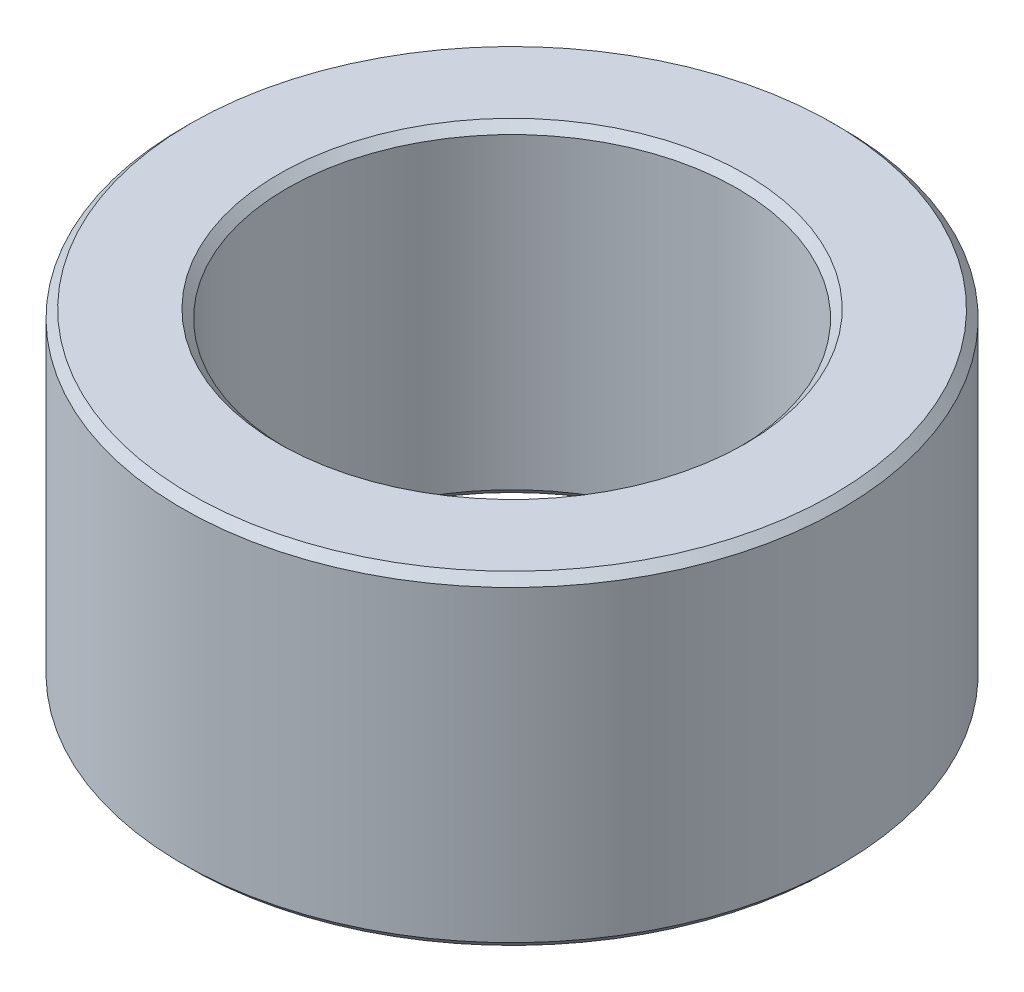
ISO-10303-21;
HEADER;
FILE_DESCRIPTION(('STEP AP214'),'2;1');
FILE_NAME('part.step','',(''),(''),'','','');
FILE_SCHEMA(('AUTOMOTIVE_DESIGN { 1 0 10303 214 1 1 1 1 }'));
ENDSEC;
DATA;
#1=APPLICATION_CONTEXT('core data for automotive mechanical design processes');
#2=APPLICATION_PROTOCOL_DEFINITION('international standard','automotive_design',2000,#1);
#3=PRODUCT_CONTEXT('',#1,'mechanical');
#4=PRODUCT('Part','Part','',(#3));
#5=PRODUCT_RELATED_PRODUCT_CATEGORY('part','',(#4));
#6=PRODUCT_DEFINITION_FORMATION('','',#4);
#7=PRODUCT_DEFINITION_CONTEXT('part definition',#1,'design');
#8=PRODUCT_DEFINITION('design','',#6,#7);
#9=PRODUCT_DEFINITION_SHAPE('','',#8);
#10=(LENGTH_UNIT() NAMED_UNIT(*) SI_UNIT(.MILLI.,.METRE.));
#11=(NAMED_UNIT(*) PLANE_ANGLE_UNIT() SI_UNIT($,.RADIAN.));
#12=(NAMED_UNIT(*) SI_UNIT($,.STERADIAN.) SOLID_ANGLE_UNIT());
#13=UNCERTAINTY_MEASURE_WITH_UNIT(LENGTH_MEASURE(1.E-05),#10,'distance_accuracy_value','');
#14=(GEOMETRIC_REPRESENTATION_CONTEXT(3) GLOBAL_UNCERTAINTY_ASSIGNED_CONTEXT((#13)) GLOBAL_UNIT_ASSIGNED_CONTEXT((#10,
#11,#12)) REPRESENTATION_CONTEXT('',''));
#15=CARTESIAN_POINT('',(0.,0.,0.));
#16=DIRECTION('',(0.,0.,1.));
#17=DIRECTION('',(1.,0.,0.));
#18=AXIS2_PLACEMENT_3D('',#15,#16,#17);
#19=CARTESIAN_POINT('',(240.,154.,75.));
#20=DIRECTION('',(0.,1.,0.));
#21=DIRECTION('',(1.,0.,0.));
#22=AXIS2_PLACEMENT_3D('',#19,#20,#21);
#23=CYLINDRICAL_SURFACE('',#22,4.1);
#24=CARTESIAN_POINT('',(240.,154.35,75.));
#25=DIRECTION('',(0.,1.,0.));
#26=DIRECTION('',(1.,0.,0.));
#27=AXIS2_PLACEMENT_3D('',#24,#25,#26);
#28=CIRCLE('',#27,4.1);
#29=CARTESIAN_POINT('',(244.1,154.35,75.));
#30=VERTEX_POINT('',#29);
#31=EDGE_CURVE('E101',#30,#30,#28,.T.);
#32=ORIENTED_EDGE('',*,*,#31,.F.);
#33=DIRECTION('',(0.,1.,0.));
#34=VECTOR('',#33,1.);
#35=CARTESIAN_POINT('',(244.1,154.,75.));
#36=LINE('',#35,#34);
#37=CARTESIAN_POINT('',(244.1,159.95,75.));
#38=VERTEX_POINT('',#37);
#39=EDGE_CURVE('E11',#30,#38,#36,.T.);
#40=ORIENTED_EDGE('',*,*,#39,.T.);
#41=CARTESIAN_POINT('',(240.,159.95,75.));
#42=DIRECTION('',(0.,1.,0.));
#43=DIRECTION('',(1.,0.,0.));
#44=AXIS2_PLACEMENT_3D('',#41,#42,#43);
#45=CIRCLE('',#44,4.1);
#46=EDGE_CURVE('E26',#38,#38,#45,.T.);
#47=ORIENTED_EDGE('',*,*,#46,.T.);
#48=ORIENTED_EDGE('',*,*,#39,.F.);
#49=EDGE_LOOP('',(#32,#40,#47,#48));
#50=FACE_BOUND('',#49,.T.);
#51=ADVANCED_FACE('F16',(#50),#23,.F.);
#52=CARTESIAN_POINT('',(240.,159.95,75.));
#53=DIRECTION('',(0.,1.,0.));
#54=DIRECTION('',(1.,0.,0.));
#55=AXIS2_PLACEMENT_3D('',#52,#53,#54);
#56=CONICAL_SURFACE('',#55,4.1,0.785398163397);
#57=DIRECTION('',(-0.707106781186548,-0.707106781186548,0.));
#58=VECTOR('',#57,1.);
#59=CARTESIAN_POINT('',(244.1,159.95,75.));
#60=LINE('',#59,#58);
#61=CARTESIAN_POINT('',(244.25,160.1,75.));
#62=VERTEX_POINT('',#61);
#63=EDGE_CURVE('E96',#62,#38,#60,.T.);
#64=ORIENTED_EDGE('',*,*,#63,.F.);
#65=CARTESIAN_POINT('',(240.,160.1,75.));
#66=DIRECTION('',(0.,1.,0.));
#67=DIRECTION('',(1.,0.,0.));
#68=AXIS2_PLACEMENT_3D('',#65,#66,#67);
#69=CIRCLE('',#68,4.25);
#70=EDGE_CURVE('E105',#62,#62,#69,.T.);
#71=ORIENTED_EDGE('',*,*,#70,.T.);
#72=ORIENTED_EDGE('',*,*,#63,.T.);
#73=ORIENTED_EDGE('',*,*,#46,.F.);
#74=EDGE_LOOP('',(#64,#71,#72,#73));
#75=FACE_BOUND('',#74,.T.);
#76=ADVANCED_FACE('F18',(#75),#56,.F.);
#77=CARTESIAN_POINT('',(240.,154.35,75.));
#78=DIRECTION('',(0.,-1.,0.));
#79=DIRECTION('',(1.,0.,0.));
#80=AXIS2_PLACEMENT_3D('',#77,#78,#79);
#81=CONICAL_SURFACE('',#80,4.1,0.785398163397);
#82=ORIENTED_EDGE('',*,*,#31,.T.);
#83=DIRECTION('',(-0.707106781186548,0.707106781186548,0.));
#84=VECTOR('',#83,1.);
#85=CARTESIAN_POINT('',(244.1,154.35,75.));
#86=LINE('',#85,#84);
#87=CARTESIAN_POINT('',(244.25,154.2,75.));
#88=VERTEX_POINT('',#87);
#89=EDGE_CURVE('E20',#88,#30,#86,.T.);
#90=ORIENTED_EDGE('',*,*,#89,.F.);
#91=CARTESIAN_POINT('',(240.,154.2,75.));
#92=DIRECTION('',(0.,1.,0.));
#93=DIRECTION('',(1.,0.,0.));
#94=AXIS2_PLACEMENT_3D('',#91,#92,#93);
#95=CIRCLE('',#94,4.25);
#96=EDGE_CURVE('E108',#88,#88,#95,.T.);
#97=ORIENTED_EDGE('',*,*,#96,.F.);
#98=ORIENTED_EDGE('',*,*,#89,.T.);
#99=EDGE_LOOP('',(#82,#90,#97,#98));
#100=FACE_BOUND('',#99,.T.);
#101=ADVANCED_FACE('F126',(#100),#81,.F.);
#102=CARTESIAN_POINT('',(240.,160.1,75.));
#103=DIRECTION('',(0.,1.,0.));
#104=DIRECTION('',(0.,0.,-1.));
#105=AXIS2_PLACEMENT_3D('',#102,#103,#104);
#106=PLANE('',#105);
#107=ORIENTED_EDGE('',*,*,#70,.F.);
#108=EDGE_LOOP('',(#107));
#109=FACE_BOUND('',#108,.T.);
#110=CARTESIAN_POINT('',(240.,160.1,75.));
#111=DIRECTION('',(0.,1.,0.));
#112=DIRECTION('',(1.,0.,0.));
#113=AXIS2_PLACEMENT_3D('',#110,#111,#112);
#114=CIRCLE('',#113,5.85);
#115=CARTESIAN_POINT('',(245.85,160.1,75.));
#116=VERTEX_POINT('',#115);
#117=EDGE_CURVE('E100',#116,#116,#114,.T.);
#118=ORIENTED_EDGE('',*,*,#117,.T.);
#119=EDGE_LOOP('',(#118));
#120=FACE_BOUND('',#119,.T.);
#121=ADVANCED_FACE('F122',(#109,#120),#106,.T.);
#122=CARTESIAN_POINT('',(240.,154.2,75.));
#123=DIRECTION('',(0.,1.,0.));
#124=DIRECTION('',(0.,0.,-1.));
#125=AXIS2_PLACEMENT_3D('',#122,#123,#124);
#126=PLANE('',#125);
#127=ORIENTED_EDGE('',*,*,#96,.T.);
#128=EDGE_LOOP('',(#127));
#129=FACE_BOUND('',#128,.T.);
#130=CARTESIAN_POINT('',(240.,154.2,75.));
#131=DIRECTION('',(0.,1.,0.));
#132=DIRECTION('',(1.,0.,0.));
#133=AXIS2_PLACEMENT_3D('',#130,#131,#132);
#134=CIRCLE('',#133,5.85);
#135=CARTESIAN_POINT('',(245.85,154.2,75.));
#136=VERTEX_POINT('',#135);
#137=EDGE_CURVE('E75',#136,#136,#134,.T.);
#138=ORIENTED_EDGE('',*,*,#137,.F.);
#139=EDGE_LOOP('',(#138));
#140=FACE_BOUND('',#139,.T.);
#141=ADVANCED_FACE('F125',(#129,#140),#126,.F.);
#142=CARTESIAN_POINT('',(240.,159.95,75.));
#143=DIRECTION('',(0.,-1.,0.));
#144=DIRECTION('',(1.,0.,0.));
#145=AXIS2_PLACEMENT_3D('',#142,#143,#144);
#146=CONICAL_SURFACE('',#145,6.,0.785398163397);
#147=DIRECTION('',(-0.707106781186548,0.707106781186548,0.));
#148=VECTOR('',#147,1.);
#149=CARTESIAN_POINT('',(246.,159.95,75.));
#150=LINE('',#149,#148);
#151=CARTESIAN_POINT('',(246.,159.95,75.));
#152=VERTEX_POINT('',#151);
#153=EDGE_CURVE('E77',#152,#116,#150,.T.);
#154=ORIENTED_EDGE('',*,*,#153,.F.);
#155=CARTESIAN_POINT('',(240.,159.95,75.));
#156=DIRECTION('',(0.,1.,0.));
#157=DIRECTION('',(1.,0.,0.));
#158=AXIS2_PLACEMENT_3D('',#155,#156,#157);
#159=CIRCLE('',#158,6.);
#160=EDGE_CURVE('E85',#152,#152,#159,.T.);
#161=ORIENTED_EDGE('',*,*,#160,.T.);
#162=ORIENTED_EDGE('',*,*,#153,.T.);
#163=ORIENTED_EDGE('',*,*,#117,.F.);
#164=EDGE_LOOP('',(#154,#161,#162,#163));
#165=FACE_BOUND('',#164,.T.);
#166=ADVANCED_FACE('F130',(#165),#146,.T.);
#167=CARTESIAN_POINT('',(240.,154.35,75.));
#168=DIRECTION('',(0.,1.,0.));
#169=DIRECTION('',(1.,0.,0.));
#170=AXIS2_PLACEMENT_3D('',#167,#168,#169);
#171=CONICAL_SURFACE('',#170,6.,0.785398163397);
#172=ORIENTED_EDGE('',*,*,#137,.T.);
#173=DIRECTION('',(-0.707106781186548,-0.707106781186548,0.));
#174=VECTOR('',#173,1.);
#175=CARTESIAN_POINT('',(246.,154.35,75.));
#176=LINE('',#175,#174);
#177=CARTESIAN_POINT('',(246.,154.35,75.));
#178=VERTEX_POINT('',#177);
#179=EDGE_CURVE('E69',#178,#136,#176,.T.);
#180=ORIENTED_EDGE('',*,*,#179,.F.);
#181=CARTESIAN_POINT('',(240.,154.35,75.));
#182=DIRECTION('',(0.,1.,0.));
#183=DIRECTION('',(1.,0.,0.));
#184=AXIS2_PLACEMENT_3D('',#181,#182,#183);
#185=CIRCLE('',#184,6.);
#186=EDGE_CURVE('E72',#178,#178,#185,.T.);
#187=ORIENTED_EDGE('',*,*,#186,.F.);
#188=ORIENTED_EDGE('',*,*,#179,.T.);
#189=EDGE_LOOP('',(#172,#180,#187,#188));
#190=FACE_BOUND('',#189,.T.);
#191=ADVANCED_FACE('F71',(#190),#171,.T.);
#192=CARTESIAN_POINT('',(240.,154.2,75.));
#193=DIRECTION('',(0.,1.,0.));
#194=DIRECTION('',(1.,0.,0.));
#195=AXIS2_PLACEMENT_3D('',#192,#193,#194);
#196=CYLINDRICAL_SURFACE('',#195,6.);
#197=DIRECTION('',(0.,1.,0.));
#198=VECTOR('',#197,1.);
#199=CARTESIAN_POINT('',(246.,154.2,75.));
#200=LINE('',#199,#198);
#201=EDGE_CURVE('E83',#178,#152,#200,.T.);
#202=ORIENTED_EDGE('',*,*,#201,.T.);
#203=ORIENTED_EDGE('',*,*,#160,.F.);
#204=ORIENTED_EDGE('',*,*,#201,.F.);
#205=ORIENTED_EDGE('',*,*,#186,.T.);
#206=EDGE_LOOP('',(#202,#203,#204,#205));
#207=FACE_BOUND('',#206,.T.);
#208=ADVANCED_FACE('F81',(#207),#196,.T.);
#209=CLOSED_SHELL('',(#51,#76,#101,#121,#141,#166,#191,#208));
#210=MANIFOLD_SOLID_BREP('B1',#209);
#211=ADVANCED_BREP_SHAPE_REPRESENTATION('',(#18,#210),#14);
#212=SHAPE_DEFINITION_REPRESENTATION(#9,#211);
ENDSEC;
END-ISO-10303-21;
